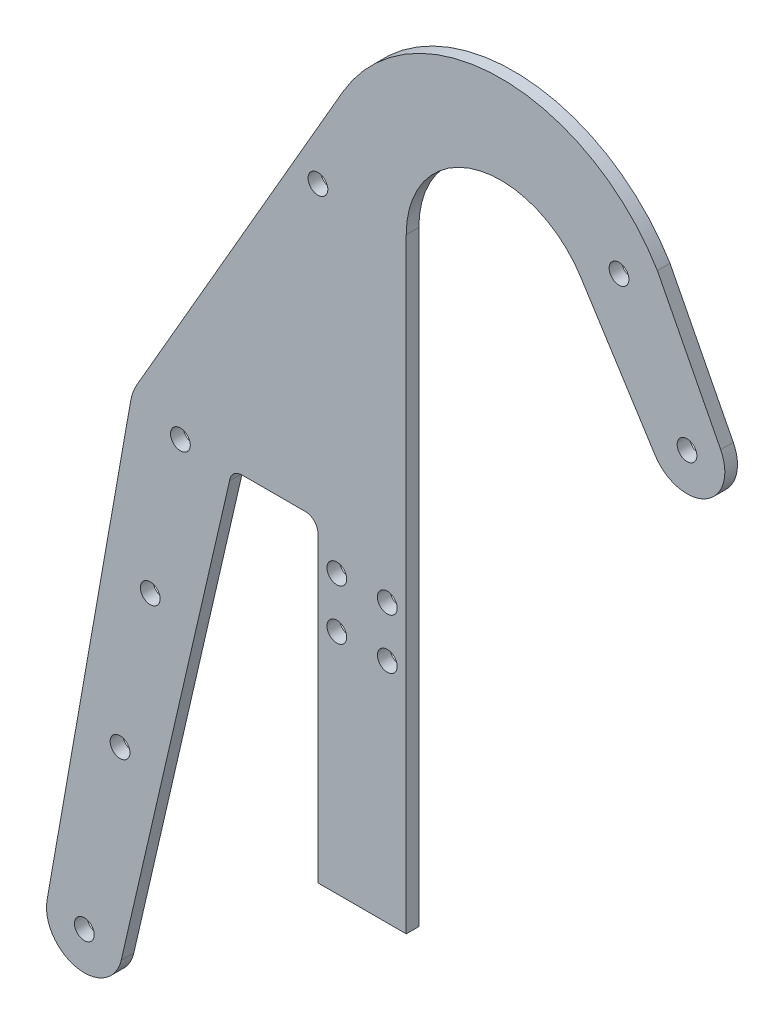
ISO-10303-21;
HEADER;
FILE_DESCRIPTION(('STEP AP214'),'2;1');
FILE_NAME('part.step','',(''),(''),'','','');
FILE_SCHEMA(('AUTOMOTIVE_DESIGN { 1 0 10303 214 1 1 1 1 }'));
ENDSEC;
DATA;
#1=APPLICATION_CONTEXT('core data for automotive mechanical design processes');
#2=APPLICATION_PROTOCOL_DEFINITION('international standard','automotive_design',2000,#1);
#3=PRODUCT_CONTEXT('',#1,'mechanical');
#4=PRODUCT('Part','Part','',(#3));
#5=PRODUCT_RELATED_PRODUCT_CATEGORY('part','',(#4));
#6=PRODUCT_DEFINITION_FORMATION('','',#4);
#7=PRODUCT_DEFINITION_CONTEXT('part definition',#1,'design');
#8=PRODUCT_DEFINITION('design','',#6,#7);
#9=PRODUCT_DEFINITION_SHAPE('','',#8);
#10=(LENGTH_UNIT() NAMED_UNIT(*) SI_UNIT(.MILLI.,.METRE.));
#11=(NAMED_UNIT(*) PLANE_ANGLE_UNIT() SI_UNIT($,.RADIAN.));
#12=(NAMED_UNIT(*) SI_UNIT($,.STERADIAN.) SOLID_ANGLE_UNIT());
#13=UNCERTAINTY_MEASURE_WITH_UNIT(LENGTH_MEASURE(1.E-05),#10,'distance_accuracy_value','');
#14=(GEOMETRIC_REPRESENTATION_CONTEXT(3) GLOBAL_UNCERTAINTY_ASSIGNED_CONTEXT((#13)) GLOBAL_UNIT_ASSIGNED_CONTEXT((#10,
#11,#12)) REPRESENTATION_CONTEXT('',''));
#15=CARTESIAN_POINT('',(0.,0.,0.));
#16=DIRECTION('',(0.,0.,1.));
#17=DIRECTION('',(1.,0.,0.));
#18=AXIS2_PLACEMENT_3D('',#15,#16,#17);
#19=CARTESIAN_POINT('',(-263.063410050495,151.879730606592,-3.175));
#20=DIRECTION('',(-0.866025403784442,0.499999999999995,0.));
#21=DIRECTION('',(-0.499999999999995,-0.866025403784442,0.));
#22=AXIS2_PLACEMENT_3D('',#19,#20,#21);
#23=PLANE('',#22);
#24=DIRECTION('',(-0.499999999999995,-0.866025403784442,0.));
#25=VECTOR('',#24,1.);
#26=CARTESIAN_POINT('',(-263.063410050495,151.879730606592,0.));
#27=LINE('',#26,#25);
#28=CARTESIAN_POINT('',(20.4553554732738,642.948637392973,0.));
#29=VERTEX_POINT('',#28);
#30=CARTESIAN_POINT('',(-31.3293552338526,553.254887392973,0.));
#31=VERTEX_POINT('',#30);
#32=EDGE_CURVE('E219',#29,#31,#27,.T.);
#33=ORIENTED_EDGE('',*,*,#32,.F.);
#34=DIRECTION('',(0.,0.,1.));
#35=VECTOR('',#34,1.);
#36=CARTESIAN_POINT('',(20.4553554732738,642.948637392973,-3.175));
#37=LINE('',#36,#35);
#38=CARTESIAN_POINT('',(20.4553554732738,642.948637392973,-3.175));
#39=VERTEX_POINT('',#38);
#40=EDGE_CURVE('E11',#39,#29,#37,.T.);
#41=ORIENTED_EDGE('',*,*,#40,.F.);
#42=DIRECTION('',(-0.499999999999995,-0.866025403784442,0.));
#43=VECTOR('',#42,1.);
#44=CARTESIAN_POINT('',(-263.063410050495,151.879730606592,-3.175));
#45=LINE('',#44,#43);
#46=CARTESIAN_POINT('',(-31.3293552338526,553.254887392973,-3.175));
#47=VERTEX_POINT('',#46);
#48=EDGE_CURVE('E310',#39,#47,#45,.T.);
#49=ORIENTED_EDGE('',*,*,#48,.T.);
#50=DIRECTION('',(0.,0.,1.));
#51=VECTOR('',#50,1.);
#52=CARTESIAN_POINT('',(-31.3293552338526,553.254887392973,-3.175));
#53=LINE('',#52,#51);
#54=EDGE_CURVE('E43',#47,#31,#53,.T.);
#55=ORIENTED_EDGE('',*,*,#54,.T.);
#56=EDGE_LOOP('',(#33,#41,#49,#55));
#57=FACE_BOUND('',#56,.T.);
#58=ADVANCED_FACE('F39',(#57),#23,.T.);
#59=CARTESIAN_POINT('',(60.3250000000001,619.929887392973,-3.175));
#60=DIRECTION('',(0.,0.,1.));
#61=DIRECTION('',(1.,0.,0.));
#62=AXIS2_PLACEMENT_3D('',#59,#60,#61);
#63=CYLINDRICAL_SURFACE('',#62,46.0375000000001);
#64=CARTESIAN_POINT('',(60.3250000000001,619.929887392973,0.));
#65=DIRECTION('',(0.,0.,1.));
#66=DIRECTION('',(1.,0.,0.));
#67=AXIS2_PLACEMENT_3D('',#64,#65,#66);
#68=CIRCLE('',#67,46.0375000000001);
#69=CARTESIAN_POINT('',(99.7257138260211,643.742387392973,0.));
#70=VERTEX_POINT('',#69);
#71=EDGE_CURVE('E261',#70,#29,#68,.T.);
#72=ORIENTED_EDGE('',*,*,#71,.F.);
#73=DIRECTION('',(0.,0.,1.));
#74=VECTOR('',#73,1.);
#75=CARTESIAN_POINT('',(99.7257138260211,643.742387392973,-3.175));
#76=LINE('',#75,#74);
#77=CARTESIAN_POINT('',(99.7257138260211,643.742387392973,-3.175));
#78=VERTEX_POINT('',#77);
#79=EDGE_CURVE('E49',#78,#70,#76,.T.);
#80=ORIENTED_EDGE('',*,*,#79,.F.);
#81=CARTESIAN_POINT('',(60.3250000000001,619.929887392973,-3.175));
#82=DIRECTION('',(0.,0.,1.));
#83=DIRECTION('',(1.,0.,0.));
#84=AXIS2_PLACEMENT_3D('',#81,#82,#83);
#85=CIRCLE('',#84,46.0375000000001);
#86=EDGE_CURVE('E168',#78,#39,#85,.T.);
#87=ORIENTED_EDGE('',*,*,#86,.T.);
#88=ORIENTED_EDGE('',*,*,#40,.T.);
#89=EDGE_LOOP('',(#72,#80,#87,#88));
#90=FACE_BOUND('',#89,.T.);
#91=ADVANCED_FACE('F315',(#90),#63,.T.);
#92=CARTESIAN_POINT('',(340.370879435505,174.58759419811,-3.175));
#93=DIRECTION('',(-0.889776673115525,-0.456396178752045,0.));
#94=DIRECTION('',(0.456396178752045,-0.889776673115525,0.));
#95=AXIS2_PLACEMENT_3D('',#92,#93,#94);
#96=PLANE('',#95);
#97=DIRECTION('',(0.456396178752045,-0.889776673115525,0.));
#98=VECTOR('',#97,1.);
#99=CARTESIAN_POINT('',(340.370879435505,174.58759419811,0.));
#100=LINE('',#99,#98);
#101=CARTESIAN_POINT('',(115.665350368936,612.666937084414,0.));
#102=VERTEX_POINT('',#101);
#103=EDGE_CURVE('E172',#70,#102,#100,.T.);
#104=ORIENTED_EDGE('',*,*,#103,.T.);
#105=DIRECTION('',(0.,0.,1.));
#106=VECTOR('',#105,1.);
#107=CARTESIAN_POINT('',(115.665350368936,612.666937084414,-3.175));
#108=LINE('',#107,#106);
#109=CARTESIAN_POINT('',(115.665350368936,612.666937084414,-3.175));
#110=VERTEX_POINT('',#109);
#111=EDGE_CURVE('E170',#110,#102,#108,.T.);
#112=ORIENTED_EDGE('',*,*,#111,.F.);
#113=DIRECTION('',(0.456396178752045,-0.889776673115525,0.));
#114=VECTOR('',#113,1.);
#115=CARTESIAN_POINT('',(340.370879435505,174.58759419811,-3.175));
#116=LINE('',#115,#114);
#117=EDGE_CURVE('E160',#78,#110,#116,.T.);
#118=ORIENTED_EDGE('',*,*,#117,.F.);
#119=ORIENTED_EDGE('',*,*,#79,.T.);
#120=EDGE_LOOP('',(#104,#112,#118,#119));
#121=FACE_BOUND('',#120,.T.);
#122=ADVANCED_FACE('F171',(#121),#96,.F.);
#123=CARTESIAN_POINT('',(107.190227557511,608.3197634818,-3.175));
#124=DIRECTION('',(0.,0.,1.));
#125=DIRECTION('',(1.,0.,0.));
#126=AXIS2_PLACEMENT_3D('',#123,#124,#125);
#127=CYLINDRICAL_SURFACE('',#126,9.52500000000024);
#128=CARTESIAN_POINT('',(107.190227557511,608.3197634818,0.));
#129=DIRECTION('',(0.,0.,1.));
#130=DIRECTION('',(1.,0.,0.));
#131=AXIS2_PLACEMENT_3D('',#128,#129,#130);
#132=CIRCLE('',#131,9.52500000000024);
#133=CARTESIAN_POINT('',(99.1496275266768,603.213455995548,0.));
#134=VERTEX_POINT('',#133);
#135=EDGE_CURVE('E258',#134,#102,#132,.T.);
#136=ORIENTED_EDGE('',*,*,#135,.F.);
#137=DIRECTION('',(0.,0.,1.));
#138=VECTOR('',#137,1.);
#139=CARTESIAN_POINT('',(99.1496275266768,603.213455995548,-3.175));
#140=LINE('',#139,#138);
#141=CARTESIAN_POINT('',(99.1496275266768,603.213455995548,-3.175));
#142=VERTEX_POINT('',#141);
#143=EDGE_CURVE('E176',#142,#134,#140,.T.);
#144=ORIENTED_EDGE('',*,*,#143,.F.);
#145=CARTESIAN_POINT('',(107.190227557511,608.3197634818,-3.175));
#146=DIRECTION('',(0.,0.,1.));
#147=DIRECTION('',(1.,0.,0.));
#148=AXIS2_PLACEMENT_3D('',#145,#146,#147);
#149=CIRCLE('',#148,9.52500000000024);
#150=EDGE_CURVE('E166',#142,#110,#149,.T.);
#151=ORIENTED_EDGE('',*,*,#150,.T.);
#152=ORIENTED_EDGE('',*,*,#111,.T.);
#153=EDGE_LOOP('',(#136,#144,#151,#152));
#154=FACE_BOUND('',#153,.T.);
#155=ADVANCED_FACE('F178',(#154),#127,.T.);
#156=CARTESIAN_POINT('',(343.63775701638,218.232475745946,-3.175));
#157=DIRECTION('',(-0.844157483552088,-0.536095274147242,0.));
#158=DIRECTION('',(0.536095274147242,-0.844157483552088,0.));
#159=AXIS2_PLACEMENT_3D('',#156,#157,#158);
#160=PLANE('',#159);
#161=DIRECTION('',(0.536095274147242,-0.844157483552088,0.));
#162=VECTOR('',#161,1.);
#163=CARTESIAN_POINT('',(343.63775701638,218.232475745946,0.));
#164=LINE('',#163,#162);
#165=CARTESIAN_POINT('',(80.4265000770842,632.695656108605,0.));
#166=VERTEX_POINT('',#165);
#167=EDGE_CURVE('E255',#166,#134,#164,.T.);
#168=ORIENTED_EDGE('',*,*,#167,.F.);
#169=DIRECTION('',(0.,0.,1.));
#170=VECTOR('',#169,1.);
#171=CARTESIAN_POINT('',(80.4265000770842,632.695656108605,-3.175));
#172=LINE('',#171,#170);
#173=CARTESIAN_POINT('',(80.4265000770842,632.695656108605,-3.175));
#174=VERTEX_POINT('',#173);
#175=EDGE_CURVE('E285',#174,#166,#172,.T.);
#176=ORIENTED_EDGE('',*,*,#175,.F.);
#177=DIRECTION('',(0.536095274147242,-0.844157483552088,0.));
#178=VECTOR('',#177,1.);
#179=CARTESIAN_POINT('',(343.63775701638,218.232475745946,-3.175));
#180=LINE('',#179,#178);
#181=EDGE_CURVE('E179',#174,#142,#180,.T.);
#182=ORIENTED_EDGE('',*,*,#181,.T.);
#183=ORIENTED_EDGE('',*,*,#143,.T.);
#184=EDGE_LOOP('',(#168,#176,#182,#183));
#185=FACE_BOUND('',#184,.T.);
#186=ADVANCED_FACE('F330',(#185),#160,.T.);
#187=CARTESIAN_POINT('',(60.3250000000001,619.929887392973,-3.175));
#188=DIRECTION('',(0.,0.,1.));
#189=DIRECTION('',(1.,0.,0.));
#190=AXIS2_PLACEMENT_3D('',#187,#188,#189);
#191=CYLINDRICAL_SURFACE('',#190,23.8125000000002);
#192=CARTESIAN_POINT('',(60.3250000000001,619.929887392973,0.));
#193=DIRECTION('',(0.,0.,1.));
#194=DIRECTION('',(1.,0.,0.));
#195=AXIS2_PLACEMENT_3D('',#192,#193,#194);
#196=CIRCLE('',#195,23.8125000000002);
#197=CARTESIAN_POINT('',(36.5124999999999,619.929887392973,0.));
#198=VERTEX_POINT('',#197);
#199=EDGE_CURVE('E252',#166,#198,#196,.T.);
#200=ORIENTED_EDGE('',*,*,#199,.T.);
#201=DIRECTION('',(0.,0.,1.));
#202=VECTOR('',#201,1.);
#203=CARTESIAN_POINT('',(36.5124999999999,619.929887392973,-3.175));
#204=LINE('',#203,#202);
#205=CARTESIAN_POINT('',(36.5124999999999,619.929887392973,-3.175));
#206=VERTEX_POINT('',#205);
#207=EDGE_CURVE('E287',#206,#198,#204,.T.);
#208=ORIENTED_EDGE('',*,*,#207,.F.);
#209=CARTESIAN_POINT('',(60.3250000000001,619.929887392973,-3.175));
#210=DIRECTION('',(0.,0.,1.));
#211=DIRECTION('',(1.,0.,0.));
#212=AXIS2_PLACEMENT_3D('',#209,#210,#211);
#213=CIRCLE('',#212,23.8125000000002);
#214=EDGE_CURVE('E181',#174,#206,#213,.T.);
#215=ORIENTED_EDGE('',*,*,#214,.F.);
#216=ORIENTED_EDGE('',*,*,#175,.T.);
#217=EDGE_LOOP('',(#200,#208,#215,#216));
#218=FACE_BOUND('',#217,.T.);
#219=ADVANCED_FACE('F333',(#218),#191,.F.);
#220=CARTESIAN_POINT('',(36.5125000000003,0.,-3.175));
#221=DIRECTION('',(1.,0.,0.));
#222=DIRECTION('',(0.,1.,0.));
#223=AXIS2_PLACEMENT_3D('',#220,#221,#222);
#224=PLANE('',#223);
#225=DIRECTION('',(0.,1.,0.));
#226=VECTOR('',#225,1.);
#227=CARTESIAN_POINT('',(36.5125000000003,0.,0.));
#228=LINE('',#227,#226);
#229=CARTESIAN_POINT('',(36.5125,467.529887392973,0.));
#230=VERTEX_POINT('',#229);
#231=EDGE_CURVE('E249',#230,#198,#228,.T.);
#232=ORIENTED_EDGE('',*,*,#231,.F.);
#233=DIRECTION('',(0.,0.,1.));
#234=VECTOR('',#233,1.);
#235=CARTESIAN_POINT('',(36.5125,467.529887392973,-3.175));
#236=LINE('',#235,#234);
#237=CARTESIAN_POINT('',(36.5125,467.529887392973,-3.175));
#238=VERTEX_POINT('',#237);
#239=EDGE_CURVE('E289',#238,#230,#236,.T.);
#240=ORIENTED_EDGE('',*,*,#239,.F.);
#241=DIRECTION('',(0.,1.,0.));
#242=VECTOR('',#241,1.);
#243=CARTESIAN_POINT('',(36.5125000000003,0.,-3.175));
#244=LINE('',#243,#242);
#245=EDGE_CURVE('E751',#238,#206,#244,.T.);
#246=ORIENTED_EDGE('',*,*,#245,.T.);
#247=ORIENTED_EDGE('',*,*,#207,.T.);
#248=EDGE_LOOP('',(#232,#240,#246,#247));
#249=FACE_BOUND('',#248,.T.);
#250=ADVANCED_FACE('F337',(#249),#224,.T.);
#251=CARTESIAN_POINT('',(0.,467.529887392973,-3.175));
#252=DIRECTION('',(0.,-1.,0.));
#253=DIRECTION('',(0.,0.,-1.));
#254=AXIS2_PLACEMENT_3D('',#251,#252,#253);
#255=PLANE('',#254);
#256=DIRECTION('',(1.,0.,0.));
#257=VECTOR('',#256,1.);
#258=CARTESIAN_POINT('',(0.,467.529887392973,0.));
#259=LINE('',#258,#257);
#260=CARTESIAN_POINT('',(14.2875,467.529887392973,0.));
#261=VERTEX_POINT('',#260);
#262=EDGE_CURVE('E246',#261,#230,#259,.T.);
#263=ORIENTED_EDGE('',*,*,#262,.F.);
#264=DIRECTION('',(0.,0.,1.));
#265=VECTOR('',#264,1.);
#266=CARTESIAN_POINT('',(14.2875,467.529887392973,-3.175));
#267=LINE('',#266,#265);
#268=CARTESIAN_POINT('',(14.2875,467.529887392973,-3.175));
#269=VERTEX_POINT('',#268);
#270=EDGE_CURVE('E291',#269,#261,#267,.T.);
#271=ORIENTED_EDGE('',*,*,#270,.F.);
#272=DIRECTION('',(1.,0.,0.));
#273=VECTOR('',#272,1.);
#274=CARTESIAN_POINT('',(0.,467.529887392973,-3.175));
#275=LINE('',#274,#273);
#276=EDGE_CURVE('E748',#269,#238,#275,.T.);
#277=ORIENTED_EDGE('',*,*,#276,.T.);
#278=ORIENTED_EDGE('',*,*,#239,.T.);
#279=EDGE_LOOP('',(#263,#271,#277,#278));
#280=FACE_BOUND('',#279,.T.);
#281=ADVANCED_FACE('F341',(#280),#255,.T.);
#282=CARTESIAN_POINT('',(14.2875,0.,-3.175));
#283=DIRECTION('',(1.,0.,0.));
#284=DIRECTION('',(0.,1.,0.));
#285=AXIS2_PLACEMENT_3D('',#282,#283,#284);
#286=PLANE('',#285);
#287=DIRECTION('',(0.,1.,0.));
#288=VECTOR('',#287,1.);
#289=CARTESIAN_POINT('',(14.2875,0.,0.));
#290=LINE('',#289,#288);
#291=CARTESIAN_POINT('',(14.2875,543.729887392973,0.));
#292=VERTEX_POINT('',#291);
#293=EDGE_CURVE('E243',#261,#292,#290,.T.);
#294=ORIENTED_EDGE('',*,*,#293,.T.);
#295=DIRECTION('',(0.,0.,1.));
#296=VECTOR('',#295,1.);
#297=CARTESIAN_POINT('',(14.2875,543.729887392973,-3.175));
#298=LINE('',#297,#296);
#299=CARTESIAN_POINT('',(14.2875,543.729887392973,-3.175));
#300=VERTEX_POINT('',#299);
#301=EDGE_CURVE('E293',#300,#292,#298,.T.);
#302=ORIENTED_EDGE('',*,*,#301,.F.);
#303=DIRECTION('',(0.,1.,0.));
#304=VECTOR('',#303,1.);
#305=CARTESIAN_POINT('',(14.2875,0.,-3.175));
#306=LINE('',#305,#304);
#307=EDGE_CURVE('E745',#269,#300,#306,.T.);
#308=ORIENTED_EDGE('',*,*,#307,.F.);
#309=ORIENTED_EDGE('',*,*,#270,.T.);
#310=EDGE_LOOP('',(#294,#302,#308,#309));
#311=FACE_BOUND('',#310,.T.);
#312=ADVANCED_FACE('F345',(#311),#286,.F.);
#313=CARTESIAN_POINT('',(11.1125,543.729887392973,-3.175));
#314=DIRECTION('',(0.,0.,1.));
#315=DIRECTION('',(1.,0.,0.));
#316=AXIS2_PLACEMENT_3D('',#313,#314,#315);
#317=CYLINDRICAL_SURFACE('',#316,3.17500000000003);
#318=CARTESIAN_POINT('',(11.1125,543.729887392973,0.));
#319=DIRECTION('',(0.,0.,1.));
#320=DIRECTION('',(1.,0.,0.));
#321=AXIS2_PLACEMENT_3D('',#318,#319,#320);
#322=CIRCLE('',#321,3.17500000000003);
#323=CARTESIAN_POINT('',(11.1125,546.904887392973,0.));
#324=VERTEX_POINT('',#323);
#325=EDGE_CURVE('E240',#292,#324,#322,.T.);
#326=ORIENTED_EDGE('',*,*,#325,.T.);
#327=DIRECTION('',(0.,0.,1.));
#328=VECTOR('',#327,1.);
#329=CARTESIAN_POINT('',(11.1125,546.904887392973,-3.175));
#330=LINE('',#329,#328);
#331=CARTESIAN_POINT('',(11.1125,546.904887392973,-3.175));
#332=VERTEX_POINT('',#331);
#333=EDGE_CURVE('E296',#332,#324,#330,.T.);
#334=ORIENTED_EDGE('',*,*,#333,.F.);
#335=CARTESIAN_POINT('',(11.1125,543.729887392973,-3.175));
#336=DIRECTION('',(0.,0.,1.));
#337=DIRECTION('',(1.,0.,0.));
#338=AXIS2_PLACEMENT_3D('',#335,#336,#337);
#339=CIRCLE('',#338,3.17500000000003);
#340=EDGE_CURVE('E742',#300,#332,#339,.T.);
#341=ORIENTED_EDGE('',*,*,#340,.F.);
#342=ORIENTED_EDGE('',*,*,#301,.T.);
#343=EDGE_LOOP('',(#326,#334,#341,#342));
#344=FACE_BOUND('',#343,.T.);
#345=ADVANCED_FACE('F349',(#344),#317,.F.);
#346=CARTESIAN_POINT('',(0.,546.904887392973,-3.175));
#347=DIRECTION('',(0.,1.,0.));
#348=DIRECTION('',(0.,0.,1.));
#349=AXIS2_PLACEMENT_3D('',#346,#347,#348);
#350=PLANE('',#349);
#351=DIRECTION('',(-1.,0.,0.));
#352=VECTOR('',#351,1.);
#353=CARTESIAN_POINT('',(0.,546.904887392973,0.));
#354=LINE('',#353,#352);
#355=CARTESIAN_POINT('',(-4.79731020611855,546.904887392973,0.));
#356=VERTEX_POINT('',#355);
#357=EDGE_CURVE('E237',#324,#356,#354,.T.);
#358=ORIENTED_EDGE('',*,*,#357,.T.);
#359=DIRECTION('',(0.,0.,1.));
#360=VECTOR('',#359,1.);
#361=CARTESIAN_POINT('',(-4.79731020611855,546.904887392973,-3.175));
#362=LINE('',#361,#360);
#363=CARTESIAN_POINT('',(-4.79731020611855,546.904887392973,-3.175));
#364=VERTEX_POINT('',#363);
#365=EDGE_CURVE('E299',#364,#356,#362,.T.);
#366=ORIENTED_EDGE('',*,*,#365,.F.);
#367=DIRECTION('',(-1.,0.,0.));
#368=VECTOR('',#367,1.);
#369=CARTESIAN_POINT('',(0.,546.904887392973,-3.175));
#370=LINE('',#369,#368);
#371=EDGE_CURVE('E739',#332,#364,#370,.T.);
#372=ORIENTED_EDGE('',*,*,#371,.F.);
#373=ORIENTED_EDGE('',*,*,#333,.T.);
#374=EDGE_LOOP('',(#358,#366,#372,#373));
#375=FACE_BOUND('',#374,.T.);
#376=ADVANCED_FACE('F353',(#375),#350,.F.);
#377=CARTESIAN_POINT('',(-4.79731020611855,543.729887392973,-3.175));
#378=DIRECTION('',(0.,0.,1.));
#379=DIRECTION('',(1.,0.,0.));
#380=AXIS2_PLACEMENT_3D('',#377,#378,#379);
#381=CYLINDRICAL_SURFACE('',#380,3.17500000000004);
#382=CARTESIAN_POINT('',(-4.79731020611855,543.729887392973,0.));
#383=DIRECTION('',(0.,0.,1.));
#384=DIRECTION('',(1.,0.,0.));
#385=AXIS2_PLACEMENT_3D('',#382,#383,#384);
#386=CIRCLE('',#385,3.17500000000004);
#387=CARTESIAN_POINT('',(-7.95633278301758,544.048009002806,0.));
#388=VERTEX_POINT('',#387);
#389=EDGE_CURVE('E234',#356,#388,#386,.T.);
#390=ORIENTED_EDGE('',*,*,#389,.T.);
#391=DIRECTION('',(0.,0.,1.));
#392=VECTOR('',#391,1.);
#393=CARTESIAN_POINT('',(-7.95633278301758,544.048009002806,-3.175));
#394=LINE('',#393,#392);
#395=CARTESIAN_POINT('',(-7.95633278301758,544.048009002806,-3.175));
#396=VERTEX_POINT('',#395);
#397=EDGE_CURVE('E302',#396,#388,#394,.T.);
#398=ORIENTED_EDGE('',*,*,#397,.F.);
#399=CARTESIAN_POINT('',(-4.79731020611855,543.729887392973,-3.175));
#400=DIRECTION('',(0.,0.,1.));
#401=DIRECTION('',(1.,0.,0.));
#402=AXIS2_PLACEMENT_3D('',#399,#400,#401);
#403=CIRCLE('',#402,3.17500000000004);
#404=EDGE_CURVE('E736',#364,#396,#403,.T.);
#405=ORIENTED_EDGE('',*,*,#404,.F.);
#406=ORIENTED_EDGE('',*,*,#365,.T.);
#407=EDGE_LOOP('',(#390,#398,#405,#406));
#408=FACE_BOUND('',#407,.T.);
#409=ADVANCED_FACE('F357',(#408),#381,.F.);
#410=CARTESIAN_POINT('',(-126.801193466818,29.274362168246,-3.175));
#411=DIRECTION('',(-0.974370064785237,0.224951054343858,0.));
#412=DIRECTION('',(-0.224951054343858,-0.974370064785237,0.));
#413=AXIS2_PLACEMENT_3D('',#410,#411,#412);
#414=PLANE('',#413);
#415=DIRECTION('',(-0.224951054343858,-0.974370064785237,0.));
#416=VECTOR('',#415,1.);
#417=CARTESIAN_POINT('',(-126.801193466818,29.274362168246,0.));
#418=LINE('',#417,#416);
#419=CARTESIAN_POINT('',(-35.2312788128785,425.907238302057,0.));
#420=VERTEX_POINT('',#419);
#421=EDGE_CURVE('E231',#388,#420,#418,.T.);
#422=ORIENTED_EDGE('',*,*,#421,.T.);
#423=DIRECTION('',(0.,0.,1.));
#424=VECTOR('',#423,1.);
#425=CARTESIAN_POINT('',(-35.2312788128785,425.907238302057,-3.175));
#426=LINE('',#425,#424);
#427=CARTESIAN_POINT('',(-35.2312788128785,425.907238302057,-3.175));
#428=VERTEX_POINT('',#427);
#429=EDGE_CURVE('E305',#428,#420,#426,.T.);
#430=ORIENTED_EDGE('',*,*,#429,.F.);
#431=DIRECTION('',(-0.224951054343858,-0.974370064785237,0.));
#432=VECTOR('',#431,1.);
#433=CARTESIAN_POINT('',(-126.801193466818,29.274362168246,-3.175));
#434=LINE('',#433,#432);
#435=EDGE_CURVE('E734',#396,#428,#434,.T.);
#436=ORIENTED_EDGE('',*,*,#435,.F.);
#437=ORIENTED_EDGE('',*,*,#397,.T.);
#438=EDGE_LOOP('',(#422,#430,#436,#437));
#439=FACE_BOUND('',#438,.T.);
#440=ADVANCED_FACE('F361',(#439),#414,.F.);
#441=CARTESIAN_POINT('',(-44.5121536799579,428.049897094683,-3.175));
#442=DIRECTION('',(0.,0.,1.));
#443=DIRECTION('',(1.,0.,0.));
#444=AXIS2_PLACEMENT_3D('',#441,#442,#443);
#445=CYLINDRICAL_SURFACE('',#444,9.52500000000001);
#446=CARTESIAN_POINT('',(-44.5121536799579,428.049897094683,0.));
#447=DIRECTION('',(0.,0.,1.));
#448=DIRECTION('',(1.,0.,0.));
#449=AXIS2_PLACEMENT_3D('',#446,#447,#448);
#450=CIRCLE('',#449,9.52500000000001);
#451=CARTESIAN_POINT('',(-53.8924475273992,429.70389598696,0.));
#452=VERTEX_POINT('',#451);
#453=EDGE_CURVE('E228',#452,#420,#450,.T.);
#454=ORIENTED_EDGE('',*,*,#453,.F.);
#455=DIRECTION('',(0.,0.,1.));
#456=VECTOR('',#455,1.);
#457=CARTESIAN_POINT('',(-53.8924475273992,429.70389598696,-3.175));
#458=LINE('',#457,#456);
#459=CARTESIAN_POINT('',(-53.8924475273992,429.70389598696,-3.175));
#460=VERTEX_POINT('',#459);
#461=EDGE_CURVE('E307',#460,#452,#458,.T.);
#462=ORIENTED_EDGE('',*,*,#461,.F.);
#463=CARTESIAN_POINT('',(-44.5121536799579,428.049897094683,-3.175));
#464=DIRECTION('',(0.,0.,1.));
#465=DIRECTION('',(1.,0.,0.));
#466=AXIS2_PLACEMENT_3D('',#463,#464,#465);
#467=CIRCLE('',#466,9.52500000000001);
#468=EDGE_CURVE('E731',#460,#428,#467,.T.);
#469=ORIENTED_EDGE('',*,*,#468,.T.);
#470=ORIENTED_EDGE('',*,*,#429,.T.);
#471=EDGE_LOOP('',(#454,#462,#469,#470));
#472=FACE_BOUND('',#471,.T.);
#473=ADVANCED_FACE('F365',(#472),#445,.T.);
#474=CARTESIAN_POINT('',(-125.751085439021,22.1733092162738,-3.175));
#475=DIRECTION('',(-0.984807753012209,0.173648177666924,0.));
#476=DIRECTION('',(-0.173648177666924,-0.984807753012209,0.));
#477=AXIS2_PLACEMENT_3D('',#474,#475,#476);
#478=PLANE('',#477);
#479=DIRECTION('',(-0.173648177666924,-0.984807753012209,0.));
#480=VECTOR('',#479,1.);
#481=CARTESIAN_POINT('',(-125.751085439021,22.1733092162738,0.));
#482=LINE('',#481,#480);
#483=CARTESIAN_POINT('',(-32.8378910690451,549.110219249343,0.));
#484=VERTEX_POINT('',#483);
#485=EDGE_CURVE('E225',#484,#452,#482,.T.);
#486=ORIENTED_EDGE('',*,*,#485,.F.);
#487=DIRECTION('',(0.,0.,1.));
#488=VECTOR('',#487,1.);
#489=CARTESIAN_POINT('',(-32.8378910690451,549.110219249343,-3.175));
#490=LINE('',#489,#488);
#491=CARTESIAN_POINT('',(-32.8378910690451,549.110219249343,-3.175));
#492=VERTEX_POINT('',#491);
#493=EDGE_CURVE('E308',#492,#484,#490,.T.);
#494=ORIENTED_EDGE('',*,*,#493,.F.);
#495=DIRECTION('',(-0.173648177666924,-0.984807753012209,0.));
#496=VECTOR('',#495,1.);
#497=CARTESIAN_POINT('',(-125.751085439021,22.1733092162738,-3.175));
#498=LINE('',#497,#496);
#499=EDGE_CURVE('E728',#492,#460,#498,.T.);
#500=ORIENTED_EDGE('',*,*,#499,.T.);
#501=ORIENTED_EDGE('',*,*,#461,.T.);
#502=EDGE_LOOP('',(#486,#494,#500,#501));
#503=FACE_BOUND('',#502,.T.);
#504=ADVANCED_FACE('F369',(#503),#478,.T.);
#505=CARTESIAN_POINT('',(107.190227557511,608.3197634818,-3.175));
#506=DIRECTION('',(0.,0.,1.));
#507=DIRECTION('',(1.,0.,0.));
#508=AXIS2_PLACEMENT_3D('',#505,#506,#507);
#509=CYLINDRICAL_SURFACE('',#508,2.48919999999998);
#510=CARTESIAN_POINT('',(107.190227557511,608.3197634818,-3.175));
#511=DIRECTION('',(0.,0.,1.));
#512=DIRECTION('',(1.,0.,0.));
#513=AXIS2_PLACEMENT_3D('',#510,#511,#512);
#514=CIRCLE('',#513,2.48919999999998);
#515=CARTESIAN_POINT('',(109.679427557511,608.3197634818,-3.175));
#516=VERTEX_POINT('',#515);
#517=EDGE_CURVE('E198',#516,#516,#514,.T.);
#518=ORIENTED_EDGE('',*,*,#517,.F.);
#519=EDGE_LOOP('',(#518));
#520=FACE_BOUND('',#519,.T.);
#521=CARTESIAN_POINT('',(107.190227557511,608.3197634818,0.));
#522=DIRECTION('',(0.,0.,1.));
#523=DIRECTION('',(1.,0.,0.));
#524=AXIS2_PLACEMENT_3D('',#521,#522,#523);
#525=CIRCLE('',#524,2.48919999999998);
#526=CARTESIAN_POINT('',(109.679427557511,608.3197634818,0.));
#527=VERTEX_POINT('',#526);
#528=EDGE_CURVE('E276',#527,#527,#525,.T.);
#529=ORIENTED_EDGE('',*,*,#528,.T.);
#530=EDGE_LOOP('',(#529));
#531=FACE_BOUND('',#530,.T.);
#532=ADVANCED_FACE('F373',(#520,#531),#509,.F.);
#533=CARTESIAN_POINT('',(19.05,524.679887392973,-3.175));
#534=DIRECTION('',(0.,0.,1.));
#535=DIRECTION('',(1.,0.,0.));
#536=AXIS2_PLACEMENT_3D('',#533,#534,#535);
#537=CYLINDRICAL_SURFACE('',#536,2.4891999999999);
#538=CARTESIAN_POINT('',(19.05,524.679887392973,-3.175));
#539=DIRECTION('',(0.,0.,1.));
#540=DIRECTION('',(1.,0.,0.));
#541=AXIS2_PLACEMENT_3D('',#538,#539,#540);
#542=CIRCLE('',#541,2.4891999999999);
#543=CARTESIAN_POINT('',(21.5391999999999,524.679887392973,-3.175));
#544=VERTEX_POINT('',#543);
#545=EDGE_CURVE('E195',#544,#544,#542,.T.);
#546=ORIENTED_EDGE('',*,*,#545,.F.);
#547=EDGE_LOOP('',(#546));
#548=FACE_BOUND('',#547,.T.);
#549=CARTESIAN_POINT('',(19.05,524.679887392973,0.));
#550=DIRECTION('',(0.,0.,1.));
#551=DIRECTION('',(1.,0.,0.));
#552=AXIS2_PLACEMENT_3D('',#549,#550,#551);
#553=CIRCLE('',#552,2.4891999999999);
#554=CARTESIAN_POINT('',(21.5391999999999,524.679887392973,0.));
#555=VERTEX_POINT('',#554);
#556=EDGE_CURVE('E273',#555,#555,#553,.T.);
#557=ORIENTED_EDGE('',*,*,#556,.T.);
#558=EDGE_LOOP('',(#557));
#559=FACE_BOUND('',#558,.T.);
#560=ADVANCED_FACE('F426',(#548,#559),#537,.F.);
#561=CARTESIAN_POINT('',(19.05,537.379887392973,-3.175));
#562=DIRECTION('',(0.,0.,1.));
#563=DIRECTION('',(1.,0.,0.));
#564=AXIS2_PLACEMENT_3D('',#561,#562,#563);
#565=CYLINDRICAL_SURFACE('',#564,2.4891999999999);
#566=CARTESIAN_POINT('',(19.05,537.379887392973,-3.175));
#567=DIRECTION('',(0.,0.,1.));
#568=DIRECTION('',(1.,0.,0.));
#569=AXIS2_PLACEMENT_3D('',#566,#567,#568);
#570=CIRCLE('',#569,2.4891999999999);
#571=CARTESIAN_POINT('',(21.5391999999999,537.379887392973,-3.175));
#572=VERTEX_POINT('',#571);
#573=EDGE_CURVE('E192',#572,#572,#570,.T.);
#574=ORIENTED_EDGE('',*,*,#573,.F.);
#575=EDGE_LOOP('',(#574));
#576=FACE_BOUND('',#575,.T.);
#577=CARTESIAN_POINT('',(19.05,537.379887392973,0.));
#578=DIRECTION('',(0.,0.,1.));
#579=DIRECTION('',(1.,0.,0.));
#580=AXIS2_PLACEMENT_3D('',#577,#578,#579);
#581=CIRCLE('',#580,2.4891999999999);
#582=CARTESIAN_POINT('',(21.5391999999999,537.379887392973,0.));
#583=VERTEX_POINT('',#582);
#584=EDGE_CURVE('E270',#583,#583,#581,.T.);
#585=ORIENTED_EDGE('',*,*,#584,.T.);
#586=EDGE_LOOP('',(#585));
#587=FACE_BOUND('',#586,.T.);
#588=ADVANCED_FACE('F430',(#576,#587),#565,.F.);
#589=CARTESIAN_POINT('',(31.75,537.379887392973,-3.175));
#590=DIRECTION('',(0.,0.,1.));
#591=DIRECTION('',(1.,0.,0.));
#592=AXIS2_PLACEMENT_3D('',#589,#590,#591);
#593=CYLINDRICAL_SURFACE('',#592,2.48919999999991);
#594=CARTESIAN_POINT('',(31.75,537.379887392973,-3.175));
#595=DIRECTION('',(0.,0.,1.));
#596=DIRECTION('',(1.,0.,0.));
#597=AXIS2_PLACEMENT_3D('',#594,#595,#596);
#598=CIRCLE('',#597,2.48919999999991);
#599=CARTESIAN_POINT('',(34.2391999999999,537.379887392973,-3.175));
#600=VERTEX_POINT('',#599);
#601=EDGE_CURVE('E189',#600,#600,#598,.T.);
#602=ORIENTED_EDGE('',*,*,#601,.F.);
#603=EDGE_LOOP('',(#602));
#604=FACE_BOUND('',#603,.T.);
#605=CARTESIAN_POINT('',(31.75,537.379887392973,0.));
#606=DIRECTION('',(0.,0.,1.));
#607=DIRECTION('',(1.,0.,0.));
#608=AXIS2_PLACEMENT_3D('',#605,#606,#607);
#609=CIRCLE('',#608,2.48919999999991);
#610=CARTESIAN_POINT('',(34.2391999999999,537.379887392973,0.));
#611=VERTEX_POINT('',#610);
#612=EDGE_CURVE('E267',#611,#611,#609,.T.);
#613=ORIENTED_EDGE('',*,*,#612,.T.);
#614=EDGE_LOOP('',(#613));
#615=FACE_BOUND('',#614,.T.);
#616=ADVANCED_FACE('F433',(#604,#615),#593,.F.);
#617=CARTESIAN_POINT('',(31.75,524.679887392973,-3.175));
#618=DIRECTION('',(0.,0.,1.));
#619=DIRECTION('',(1.,0.,0.));
#620=AXIS2_PLACEMENT_3D('',#617,#618,#619);
#621=CYLINDRICAL_SURFACE('',#620,2.48919999999991);
#622=CARTESIAN_POINT('',(31.75,524.679887392973,-3.175));
#623=DIRECTION('',(0.,0.,1.));
#624=DIRECTION('',(1.,0.,0.));
#625=AXIS2_PLACEMENT_3D('',#622,#623,#624);
#626=CIRCLE('',#625,2.48919999999991);
#627=CARTESIAN_POINT('',(34.2391999999999,524.679887392973,-3.175));
#628=VERTEX_POINT('',#627);
#629=EDGE_CURVE('E186',#628,#628,#626,.T.);
#630=ORIENTED_EDGE('',*,*,#629,.F.);
#631=EDGE_LOOP('',(#630));
#632=FACE_BOUND('',#631,.T.);
#633=CARTESIAN_POINT('',(31.75,524.679887392973,0.));
#634=DIRECTION('',(0.,0.,1.));
#635=DIRECTION('',(1.,0.,0.));
#636=AXIS2_PLACEMENT_3D('',#633,#634,#635);
#637=CIRCLE('',#636,2.48919999999991);
#638=CARTESIAN_POINT('',(34.2391999999999,524.679887392973,0.));
#639=VERTEX_POINT('',#638);
#640=EDGE_CURVE('E264',#639,#639,#637,.T.);
#641=ORIENTED_EDGE('',*,*,#640,.T.);
#642=EDGE_LOOP('',(#641));
#643=FACE_BOUND('',#642,.T.);
#644=ADVANCED_FACE('F325',(#632,#643),#621,.F.);
#645=CARTESIAN_POINT('',(-20.33083260579,546.904887392973,-3.175));
#646=DIRECTION('',(0.,0.,1.));
#647=DIRECTION('',(1.,0.,0.));
#648=AXIS2_PLACEMENT_3D('',#645,#646,#647);
#649=CYLINDRICAL_SURFACE('',#648,12.7);
#650=CARTESIAN_POINT('',(-20.33083260579,546.904887392973,0.));
#651=DIRECTION('',(0.,0.,1.));
#652=DIRECTION('',(1.,0.,0.));
#653=AXIS2_PLACEMENT_3D('',#650,#651,#652);
#654=CIRCLE('',#653,12.7);
#655=EDGE_CURVE('E222',#31,#484,#654,.T.);
#656=ORIENTED_EDGE('',*,*,#655,.F.);
#657=ORIENTED_EDGE('',*,*,#54,.F.);
#658=CARTESIAN_POINT('',(-20.33083260579,546.904887392973,-3.175));
#659=DIRECTION('',(0.,0.,1.));
#660=DIRECTION('',(1.,0.,0.));
#661=AXIS2_PLACEMENT_3D('',#658,#659,#660);
#662=CIRCLE('',#661,12.7);
#663=EDGE_CURVE('E722',#47,#492,#662,.T.);
#664=ORIENTED_EDGE('',*,*,#663,.T.);
#665=ORIENTED_EDGE('',*,*,#493,.T.);
#666=EDGE_LOOP('',(#656,#657,#664,#665));
#667=FACE_BOUND('',#666,.T.);
#668=ADVANCED_FACE('F311',(#667),#649,.T.);
#669=CARTESIAN_POINT('',(-44.5121536799579,428.049897094683,-3.175));
#670=DIRECTION('',(0.,0.,1.));
#671=DIRECTION('',(1.,0.,0.));
#672=AXIS2_PLACEMENT_3D('',#669,#670,#671);
#673=CYLINDRICAL_SURFACE('',#672,2.4892);
#674=CARTESIAN_POINT('',(-44.5121536799579,428.049897094683,-3.175));
#675=DIRECTION('',(0.,0.,1.));
#676=DIRECTION('',(1.,0.,0.));
#677=AXIS2_PLACEMENT_3D('',#674,#675,#676);
#678=CIRCLE('',#677,2.4892);
#679=CARTESIAN_POINT('',(-42.0229536799579,428.049897094683,-3.175));
#680=VERTEX_POINT('',#679);
#681=EDGE_CURVE('E720',#680,#680,#678,.T.);
#682=ORIENTED_EDGE('',*,*,#681,.F.);
#683=EDGE_LOOP('',(#682));
#684=FACE_BOUND('',#683,.T.);
#685=CARTESIAN_POINT('',(-44.5121536799579,428.049897094683,0.));
#686=DIRECTION('',(0.,0.,1.));
#687=DIRECTION('',(1.,0.,0.));
#688=AXIS2_PLACEMENT_3D('',#685,#686,#687);
#689=CIRCLE('',#688,2.4892);
#690=CARTESIAN_POINT('',(-42.0229536799579,428.049897094683,0.));
#691=VERTEX_POINT('',#690);
#692=EDGE_CURVE('E216',#691,#691,#689,.T.);
#693=ORIENTED_EDGE('',*,*,#692,.T.);
#694=EDGE_LOOP('',(#693));
#695=FACE_BOUND('',#694,.T.);
#696=ADVANCED_FACE('F376',(#684,#695),#673,.F.);
#697=CARTESIAN_POINT('',(-35.5226692083799,472.234624900866,-3.175));
#698=DIRECTION('',(0.,0.,1.));
#699=DIRECTION('',(1.,0.,0.));
#700=AXIS2_PLACEMENT_3D('',#697,#698,#699);
#701=CYLINDRICAL_SURFACE('',#700,2.48920000000002);
#702=CARTESIAN_POINT('',(-35.5226692083799,472.234624900866,-3.175));
#703=DIRECTION('',(0.,0.,1.));
#704=DIRECTION('',(1.,0.,0.));
#705=AXIS2_PLACEMENT_3D('',#702,#703,#704);
#706=CIRCLE('',#705,2.48920000000002);
#707=CARTESIAN_POINT('',(-33.0334692083799,472.234624900866,-3.175));
#708=VERTEX_POINT('',#707);
#709=EDGE_CURVE('E717',#708,#708,#706,.T.);
#710=ORIENTED_EDGE('',*,*,#709,.F.);
#711=EDGE_LOOP('',(#710));
#712=FACE_BOUND('',#711,.T.);
#713=CARTESIAN_POINT('',(-35.5226692083799,472.234624900866,0.));
#714=DIRECTION('',(0.,0.,1.));
#715=DIRECTION('',(1.,0.,0.));
#716=AXIS2_PLACEMENT_3D('',#713,#714,#715);
#717=CIRCLE('',#716,2.48920000000002);
#718=CARTESIAN_POINT('',(-33.0334692083799,472.234624900866,0.));
#719=VERTEX_POINT('',#718);
#720=EDGE_CURVE('E213',#719,#719,#717,.T.);
#721=ORIENTED_EDGE('',*,*,#720,.T.);
#722=EDGE_LOOP('',(#721));
#723=FACE_BOUND('',#722,.T.);
#724=ADVANCED_FACE('F380',(#712,#723),#701,.F.);
#725=CARTESIAN_POINT('',(-27.9267509070849,509.56975614692,-3.175));
#726=DIRECTION('',(0.,0.,1.));
#727=DIRECTION('',(1.,0.,0.));
#728=AXIS2_PLACEMENT_3D('',#725,#726,#727);
#729=CYLINDRICAL_SURFACE('',#728,2.4892);
#730=CARTESIAN_POINT('',(-27.9267509070849,509.56975614692,-3.175));
#731=DIRECTION('',(0.,0.,1.));
#732=DIRECTION('',(1.,0.,0.));
#733=AXIS2_PLACEMENT_3D('',#730,#731,#732);
#734=CIRCLE('',#733,2.4892);
#735=CARTESIAN_POINT('',(-25.4375509070849,509.56975614692,-3.175));
#736=VERTEX_POINT('',#735);
#737=EDGE_CURVE('E713',#736,#736,#734,.T.);
#738=ORIENTED_EDGE('',*,*,#737,.F.);
#739=EDGE_LOOP('',(#738));
#740=FACE_BOUND('',#739,.T.);
#741=CARTESIAN_POINT('',(-27.9267509070849,509.56975614692,0.));
#742=DIRECTION('',(0.,0.,1.));
#743=DIRECTION('',(1.,0.,0.));
#744=AXIS2_PLACEMENT_3D('',#741,#742,#743);
#745=CIRCLE('',#744,2.4892);
#746=CARTESIAN_POINT('',(-25.4375509070849,509.56975614692,0.));
#747=VERTEX_POINT('',#746);
#748=EDGE_CURVE('E210',#747,#747,#745,.T.);
#749=ORIENTED_EDGE('',*,*,#748,.T.);
#750=EDGE_LOOP('',(#749));
#751=FACE_BOUND('',#750,.T.);
#752=ADVANCED_FACE('F384',(#740,#751),#729,.F.);
#753=CARTESIAN_POINT('',(-20.33083260579,546.904887392973,-3.175));
#754=DIRECTION('',(0.,0.,1.));
#755=DIRECTION('',(1.,0.,0.));
#756=AXIS2_PLACEMENT_3D('',#753,#754,#755);
#757=CYLINDRICAL_SURFACE('',#756,2.48919999999996);
#758=CARTESIAN_POINT('',(-20.33083260579,546.904887392973,-3.175));
#759=DIRECTION('',(0.,0.,1.));
#760=DIRECTION('',(1.,0.,0.));
#761=AXIS2_PLACEMENT_3D('',#758,#759,#760);
#762=CIRCLE('',#761,2.48919999999996);
#763=CARTESIAN_POINT('',(-17.84163260579,546.904887392973,-3.175));
#764=VERTEX_POINT('',#763);
#765=EDGE_CURVE('E399',#764,#764,#762,.T.);
#766=ORIENTED_EDGE('',*,*,#765,.F.);
#767=EDGE_LOOP('',(#766));
#768=FACE_BOUND('',#767,.T.);
#769=CARTESIAN_POINT('',(-20.33083260579,546.904887392973,0.));
#770=DIRECTION('',(0.,0.,1.));
#771=DIRECTION('',(1.,0.,0.));
#772=AXIS2_PLACEMENT_3D('',#769,#770,#771);
#773=CIRCLE('',#772,2.48919999999996);
#774=CARTESIAN_POINT('',(-17.84163260579,546.904887392973,0.));
#775=VERTEX_POINT('',#774);
#776=EDGE_CURVE('E207',#775,#775,#773,.T.);
#777=ORIENTED_EDGE('',*,*,#776,.T.);
#778=EDGE_LOOP('',(#777));
#779=FACE_BOUND('',#778,.T.);
#780=ADVANCED_FACE('F387',(#768,#779),#757,.F.);
#781=CARTESIAN_POINT('',(14.2875,619.929887392973,-3.175));
#782=DIRECTION('',(0.,0.,1.));
#783=DIRECTION('',(1.,0.,0.));
#784=AXIS2_PLACEMENT_3D('',#781,#782,#783);
#785=CYLINDRICAL_SURFACE('',#784,2.48919999999996);
#786=CARTESIAN_POINT('',(14.2875,619.929887392973,-3.175));
#787=DIRECTION('',(0.,0.,1.));
#788=DIRECTION('',(1.,0.,0.));
#789=AXIS2_PLACEMENT_3D('',#786,#787,#788);
#790=CIRCLE('',#789,2.48919999999996);
#791=CARTESIAN_POINT('',(16.7767,619.929887392973,-3.175));
#792=VERTEX_POINT('',#791);
#793=EDGE_CURVE('E281',#792,#792,#790,.T.);
#794=ORIENTED_EDGE('',*,*,#793,.F.);
#795=EDGE_LOOP('',(#794));
#796=FACE_BOUND('',#795,.T.);
#797=CARTESIAN_POINT('',(14.2875,619.929887392973,0.));
#798=DIRECTION('',(0.,0.,1.));
#799=DIRECTION('',(1.,0.,0.));
#800=AXIS2_PLACEMENT_3D('',#797,#798,#799);
#801=CIRCLE('',#800,2.48919999999996);
#802=CARTESIAN_POINT('',(16.7767,619.929887392973,0.));
#803=VERTEX_POINT('',#802);
#804=EDGE_CURVE('E204',#803,#803,#801,.T.);
#805=ORIENTED_EDGE('',*,*,#804,.T.);
#806=EDGE_LOOP('',(#805));
#807=FACE_BOUND('',#806,.T.);
#808=ADVANCED_FACE('F41',(#796,#807),#785,.F.);
#809=CARTESIAN_POINT('',(90.0761069515527,638.219021750789,-3.175));
#810=DIRECTION('',(0.,0.,1.));
#811=DIRECTION('',(1.,0.,0.));
#812=AXIS2_PLACEMENT_3D('',#809,#810,#811);
#813=CYLINDRICAL_SURFACE('',#812,2.48919999999998);
#814=CARTESIAN_POINT('',(90.0761069515527,638.219021750789,-3.175));
#815=DIRECTION('',(0.,0.,1.));
#816=DIRECTION('',(1.,0.,0.));
#817=AXIS2_PLACEMENT_3D('',#814,#815,#816);
#818=CIRCLE('',#817,2.48919999999998);
#819=CARTESIAN_POINT('',(92.5653069515527,638.219021750789,-3.175));
#820=VERTEX_POINT('',#819);
#821=EDGE_CURVE('E201',#820,#820,#818,.T.);
#822=ORIENTED_EDGE('',*,*,#821,.F.);
#823=EDGE_LOOP('',(#822));
#824=FACE_BOUND('',#823,.T.);
#825=CARTESIAN_POINT('',(90.0761069515527,638.219021750789,0.));
#826=DIRECTION('',(0.,0.,1.));
#827=DIRECTION('',(1.,0.,0.));
#828=AXIS2_PLACEMENT_3D('',#825,#826,#827);
#829=CIRCLE('',#828,2.48919999999998);
#830=CARTESIAN_POINT('',(92.5653069515527,638.219021750789,0.));
#831=VERTEX_POINT('',#830);
#832=EDGE_CURVE('E279',#831,#831,#829,.T.);
#833=ORIENTED_EDGE('',*,*,#832,.T.);
#834=EDGE_LOOP('',(#833));
#835=FACE_BOUND('',#834,.T.);
#836=ADVANCED_FACE('F394',(#824,#835),#813,.F.);
#837=CARTESIAN_POINT('',(0.,0.,-3.175));
#838=DIRECTION('',(0.,0.,1.));
#839=DIRECTION('',(1.,0.,0.));
#840=AXIS2_PLACEMENT_3D('',#837,#838,#839);
#841=PLANE('',#840);
#842=ORIENTED_EDGE('',*,*,#793,.T.);
#843=EDGE_LOOP('',(#842));
#844=FACE_BOUND('',#843,.T.);
#845=ORIENTED_EDGE('',*,*,#765,.T.);
#846=EDGE_LOOP('',(#845));
#847=FACE_BOUND('',#846,.T.);
#848=ORIENTED_EDGE('',*,*,#737,.T.);
#849=EDGE_LOOP('',(#848));
#850=FACE_BOUND('',#849,.T.);
#851=ORIENTED_EDGE('',*,*,#709,.T.);
#852=EDGE_LOOP('',(#851));
#853=FACE_BOUND('',#852,.T.);
#854=ORIENTED_EDGE('',*,*,#681,.T.);
#855=EDGE_LOOP('',(#854));
#856=FACE_BOUND('',#855,.T.);
#857=ORIENTED_EDGE('',*,*,#48,.F.);
#858=ORIENTED_EDGE('',*,*,#86,.F.);
#859=ORIENTED_EDGE('',*,*,#117,.T.);
#860=ORIENTED_EDGE('',*,*,#150,.F.);
#861=ORIENTED_EDGE('',*,*,#181,.F.);
#862=ORIENTED_EDGE('',*,*,#214,.T.);
#863=ORIENTED_EDGE('',*,*,#245,.F.);
#864=ORIENTED_EDGE('',*,*,#276,.F.);
#865=ORIENTED_EDGE('',*,*,#307,.T.);
#866=ORIENTED_EDGE('',*,*,#340,.T.);
#867=ORIENTED_EDGE('',*,*,#371,.T.);
#868=ORIENTED_EDGE('',*,*,#404,.T.);
#869=ORIENTED_EDGE('',*,*,#435,.T.);
#870=ORIENTED_EDGE('',*,*,#468,.F.);
#871=ORIENTED_EDGE('',*,*,#499,.F.);
#872=ORIENTED_EDGE('',*,*,#663,.F.);
#873=EDGE_LOOP('',(#857,#858,#859,#860,#861,#862,#863,#864,#865,#866,#867,#868,#869,#870,#871,#872));
#874=FACE_BOUND('',#873,.T.);
#875=ORIENTED_EDGE('',*,*,#629,.T.);
#876=EDGE_LOOP('',(#875));
#877=FACE_BOUND('',#876,.T.);
#878=ORIENTED_EDGE('',*,*,#601,.T.);
#879=EDGE_LOOP('',(#878));
#880=FACE_BOUND('',#879,.T.);
#881=ORIENTED_EDGE('',*,*,#573,.T.);
#882=EDGE_LOOP('',(#881));
#883=FACE_BOUND('',#882,.T.);
#884=ORIENTED_EDGE('',*,*,#545,.T.);
#885=EDGE_LOOP('',(#884));
#886=FACE_BOUND('',#885,.T.);
#887=ORIENTED_EDGE('',*,*,#517,.T.);
#888=EDGE_LOOP('',(#887));
#889=FACE_BOUND('',#888,.T.);
#890=ORIENTED_EDGE('',*,*,#821,.T.);
#891=EDGE_LOOP('',(#890));
#892=FACE_BOUND('',#891,.T.);
#893=ADVANCED_FACE('F162',(#844,#847,#850,#853,#856,#874,#877,#880,#883,#886,#889,#892),#841,.F.);
#894=CARTESIAN_POINT('',(0.,0.,0.));
#895=DIRECTION('',(0.,0.,1.));
#896=DIRECTION('',(1.,0.,0.));
#897=AXIS2_PLACEMENT_3D('',#894,#895,#896);
#898=PLANE('',#897);
#899=ORIENTED_EDGE('',*,*,#804,.F.);
#900=EDGE_LOOP('',(#899));
#901=FACE_BOUND('',#900,.T.);
#902=ORIENTED_EDGE('',*,*,#776,.F.);
#903=EDGE_LOOP('',(#902));
#904=FACE_BOUND('',#903,.T.);
#905=ORIENTED_EDGE('',*,*,#748,.F.);
#906=EDGE_LOOP('',(#905));
#907=FACE_BOUND('',#906,.T.);
#908=ORIENTED_EDGE('',*,*,#720,.F.);
#909=EDGE_LOOP('',(#908));
#910=FACE_BOUND('',#909,.T.);
#911=ORIENTED_EDGE('',*,*,#692,.F.);
#912=EDGE_LOOP('',(#911));
#913=FACE_BOUND('',#912,.T.);
#914=ORIENTED_EDGE('',*,*,#32,.T.);
#915=ORIENTED_EDGE('',*,*,#655,.T.);
#916=ORIENTED_EDGE('',*,*,#485,.T.);
#917=ORIENTED_EDGE('',*,*,#453,.T.);
#918=ORIENTED_EDGE('',*,*,#421,.F.);
#919=ORIENTED_EDGE('',*,*,#389,.F.);
#920=ORIENTED_EDGE('',*,*,#357,.F.);
#921=ORIENTED_EDGE('',*,*,#325,.F.);
#922=ORIENTED_EDGE('',*,*,#293,.F.);
#923=ORIENTED_EDGE('',*,*,#262,.T.);
#924=ORIENTED_EDGE('',*,*,#231,.T.);
#925=ORIENTED_EDGE('',*,*,#199,.F.);
#926=ORIENTED_EDGE('',*,*,#167,.T.);
#927=ORIENTED_EDGE('',*,*,#135,.T.);
#928=ORIENTED_EDGE('',*,*,#103,.F.);
#929=ORIENTED_EDGE('',*,*,#71,.T.);
#930=EDGE_LOOP('',(#914,#915,#916,#917,#918,#919,#920,#921,#922,#923,#924,#925,#926,#927,#928,#929));
#931=FACE_BOUND('',#930,.T.);
#932=ORIENTED_EDGE('',*,*,#640,.F.);
#933=EDGE_LOOP('',(#932));
#934=FACE_BOUND('',#933,.T.);
#935=ORIENTED_EDGE('',*,*,#612,.F.);
#936=EDGE_LOOP('',(#935));
#937=FACE_BOUND('',#936,.T.);
#938=ORIENTED_EDGE('',*,*,#584,.F.);
#939=EDGE_LOOP('',(#938));
#940=FACE_BOUND('',#939,.T.);
#941=ORIENTED_EDGE('',*,*,#556,.F.);
#942=EDGE_LOOP('',(#941));
#943=FACE_BOUND('',#942,.T.);
#944=ORIENTED_EDGE('',*,*,#528,.F.);
#945=EDGE_LOOP('',(#944));
#946=FACE_BOUND('',#945,.T.);
#947=ORIENTED_EDGE('',*,*,#832,.F.);
#948=EDGE_LOOP('',(#947));
#949=FACE_BOUND('',#948,.T.);
#950=ADVANCED_FACE('F313',(#901,#904,#907,#910,#913,#931,#934,#937,#940,#943,#946,#949),#898,.T.);
#951=CLOSED_SHELL('',(#58,#91,#122,#155,#186,#219,#250,#281,#312,#345,#376,#409,#440,#473,#504,
#532,#560,#588,#616,#644,#668,#696,#724,#752,#780,#808,#836,#893,#950));
#952=MANIFOLD_SOLID_BREP('B2',#951);
#953=ADVANCED_BREP_SHAPE_REPRESENTATION('',(#18,#952),#14);
#954=SHAPE_DEFINITION_REPRESENTATION(#9,#953);
ENDSEC;
END-ISO-10303-21;
